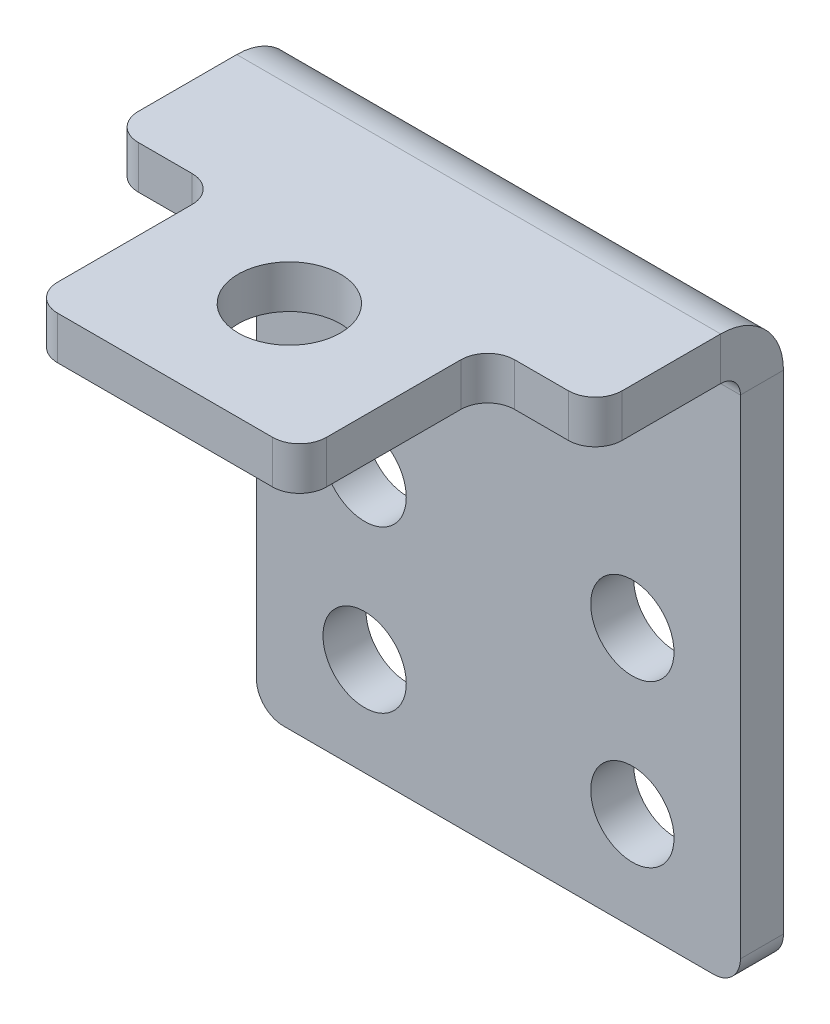
ISO-10303-21;
HEADER;
FILE_DESCRIPTION(('STEP AP214'),'2;1');
FILE_NAME('part.step','',(''),(''),'','','');
FILE_SCHEMA(('AUTOMOTIVE_DESIGN { 1 0 10303 214 1 1 1 1 }'));
ENDSEC;
DATA;
#1=APPLICATION_CONTEXT('core data for automotive mechanical design processes');
#2=APPLICATION_PROTOCOL_DEFINITION('international standard','automotive_design',2000,#1);
#3=PRODUCT_CONTEXT('',#1,'mechanical');
#4=PRODUCT('Part','Part','',(#3));
#5=PRODUCT_RELATED_PRODUCT_CATEGORY('part','',(#4));
#6=PRODUCT_DEFINITION_FORMATION('','',#4);
#7=PRODUCT_DEFINITION_CONTEXT('part definition',#1,'design');
#8=PRODUCT_DEFINITION('design','',#6,#7);
#9=PRODUCT_DEFINITION_SHAPE('','',#8);
#10=(LENGTH_UNIT() NAMED_UNIT(*) SI_UNIT(.MILLI.,.METRE.));
#11=(NAMED_UNIT(*) PLANE_ANGLE_UNIT() SI_UNIT($,.RADIAN.));
#12=(NAMED_UNIT(*) SI_UNIT($,.STERADIAN.) SOLID_ANGLE_UNIT());
#13=UNCERTAINTY_MEASURE_WITH_UNIT(LENGTH_MEASURE(1.E-05),#10,'distance_accuracy_value','');
#14=(GEOMETRIC_REPRESENTATION_CONTEXT(3) GLOBAL_UNCERTAINTY_ASSIGNED_CONTEXT((#13)) GLOBAL_UNIT_ASSIGNED_CONTEXT((#10,
#11,#12)) REPRESENTATION_CONTEXT('',''));
#15=CARTESIAN_POINT('',(0.,0.,0.));
#16=DIRECTION('',(0.,0.,1.));
#17=DIRECTION('',(1.,0.,0.));
#18=AXIS2_PLACEMENT_3D('',#15,#16,#17);
#19=CARTESIAN_POINT('',(0.,0.,-1.6));
#20=DIRECTION('',(-1.,0.,0.));
#21=DIRECTION('',(0.,0.,1.));
#22=AXIS2_PLACEMENT_3D('',#19,#20,#21);
#23=PLANE('',#22);
#24=DIRECTION('',(0.,-1.,0.));
#25=VECTOR('',#24,1.);
#26=CARTESIAN_POINT('',(0.,0.,-1.6));
#27=LINE('',#26,#25);
#28=CARTESIAN_POINT('',(0.,19.1634,-1.6));
#29=VERTEX_POINT('',#28);
#30=CARTESIAN_POINT('',(0.,1.,-1.6));
#31=VERTEX_POINT('',#30);
#32=EDGE_CURVE('E324',#29,#31,#27,.T.);
#33=ORIENTED_EDGE('',*,*,#32,.T.);
#34=DIRECTION('',(0.,0.,1.));
#35=VECTOR('',#34,1.);
#36=CARTESIAN_POINT('',(0.,1.,-1.6));
#37=LINE('',#36,#35);
#38=CARTESIAN_POINT('',(0.,1.,0.));
#39=VERTEX_POINT('',#38);
#40=EDGE_CURVE('E379',#31,#39,#37,.T.);
#41=ORIENTED_EDGE('',*,*,#40,.T.);
#42=DIRECTION('',(0.,-1.,0.));
#43=VECTOR('',#42,1.);
#44=CARTESIAN_POINT('',(0.,0.,0.));
#45=LINE('',#44,#43);
#46=CARTESIAN_POINT('',(0.,19.1634,0.));
#47=VERTEX_POINT('',#46);
#48=EDGE_CURVE('E321',#47,#39,#45,.T.);
#49=ORIENTED_EDGE('',*,*,#48,.F.);
#50=DIRECTION('',(0.,0.,-1.));
#51=VECTOR('',#50,1.);
#52=CARTESIAN_POINT('',(0.,19.1634,0.));
#53=LINE('',#52,#51);
#54=EDGE_CURVE('E306',#47,#29,#53,.T.);
#55=ORIENTED_EDGE('',*,*,#54,.T.);
#56=EDGE_LOOP('',(#33,#41,#49,#55));
#57=FACE_BOUND('',#56,.T.);
#58=ADVANCED_FACE('F69',(#57),#23,.T.);
#59=CARTESIAN_POINT('',(0.,0.,-1.6));
#60=DIRECTION('',(0.,0.,-1.));
#61=DIRECTION('',(-1.,0.,0.));
#62=AXIS2_PLACEMENT_3D('',#59,#60,#61);
#63=PLANE('',#62);
#64=CARTESIAN_POINT('',(13.98,9.65000000000004,-1.6));
#65=DIRECTION('',(0.,0.,-1.));
#66=DIRECTION('',(-1.,0.,0.));
#67=AXIS2_PLACEMENT_3D('',#64,#65,#66);
#68=CIRCLE('',#67,1.5494);
#69=CARTESIAN_POINT('',(12.4306,9.65000000000004,-1.6));
#70=VERTEX_POINT('',#69);
#71=EDGE_CURVE('E493',#70,#70,#68,.T.);
#72=ORIENTED_EDGE('',*,*,#71,.F.);
#73=EDGE_LOOP('',(#72));
#74=FACE_BOUND('',#73,.T.);
#75=CARTESIAN_POINT('',(4.02,3.65000000000004,-1.6));
#76=DIRECTION('',(0.,0.,-1.));
#77=DIRECTION('',(-1.,0.,0.));
#78=AXIS2_PLACEMENT_3D('',#75,#76,#77);
#79=CIRCLE('',#78,1.5494);
#80=CARTESIAN_POINT('',(2.4706,3.65000000000004,-1.6));
#81=VERTEX_POINT('',#80);
#82=EDGE_CURVE('E505',#81,#81,#79,.T.);
#83=ORIENTED_EDGE('',*,*,#82,.F.);
#84=EDGE_LOOP('',(#83));
#85=FACE_BOUND('',#84,.T.);
#86=CARTESIAN_POINT('',(13.98,3.65000000000004,-1.6));
#87=DIRECTION('',(0.,0.,-1.));
#88=DIRECTION('',(-1.,0.,0.));
#89=AXIS2_PLACEMENT_3D('',#86,#87,#88);
#90=CIRCLE('',#89,1.5494);
#91=CARTESIAN_POINT('',(12.4306,3.65000000000004,-1.6));
#92=VERTEX_POINT('',#91);
#93=EDGE_CURVE('E509',#92,#92,#90,.T.);
#94=ORIENTED_EDGE('',*,*,#93,.F.);
#95=EDGE_LOOP('',(#94));
#96=FACE_BOUND('',#95,.T.);
#97=CARTESIAN_POINT('',(4.02,9.65000000000004,-1.6));
#98=DIRECTION('',(0.,0.,-1.));
#99=DIRECTION('',(-1.,0.,0.));
#100=AXIS2_PLACEMENT_3D('',#97,#98,#99);
#101=CIRCLE('',#100,1.5494);
#102=CARTESIAN_POINT('',(2.4706,9.65000000000004,-1.6));
#103=VERTEX_POINT('',#102);
#104=EDGE_CURVE('E513',#103,#103,#101,.T.);
#105=ORIENTED_EDGE('',*,*,#104,.F.);
#106=EDGE_LOOP('',(#105));
#107=FACE_BOUND('',#106,.T.);
#108=DIRECTION('',(0.,1.,0.));
#109=VECTOR('',#108,1.);
#110=CARTESIAN_POINT('',(18.,0.,-1.6));
#111=LINE('',#110,#109);
#112=CARTESIAN_POINT('',(18.,1.,-1.6));
#113=VERTEX_POINT('',#112);
#114=CARTESIAN_POINT('',(18.,19.1634,-1.6));
#115=VERTEX_POINT('',#114);
#116=EDGE_CURVE('E333',#113,#115,#111,.T.);
#117=ORIENTED_EDGE('',*,*,#116,.F.);
#118=CARTESIAN_POINT('',(17.,1.,-1.6));
#119=DIRECTION('',(0.,0.,-1.));
#120=DIRECTION('',(-1.,0.,0.));
#121=AXIS2_PLACEMENT_3D('',#118,#119,#120);
#122=CIRCLE('',#121,1.);
#123=CARTESIAN_POINT('',(17.,0.,-1.6));
#124=VERTEX_POINT('',#123);
#125=EDGE_CURVE('E376',#113,#124,#122,.T.);
#126=ORIENTED_EDGE('',*,*,#125,.T.);
#127=DIRECTION('',(1.,0.,0.));
#128=VECTOR('',#127,1.);
#129=CARTESIAN_POINT('',(0.,0.,-1.6));
#130=LINE('',#129,#128);
#131=CARTESIAN_POINT('',(1.,0.,-1.6));
#132=VERTEX_POINT('',#131);
#133=EDGE_CURVE('E328',#132,#124,#130,.T.);
#134=ORIENTED_EDGE('',*,*,#133,.F.);
#135=CARTESIAN_POINT('',(1.,1.,-1.6));
#136=DIRECTION('',(0.,0.,-1.));
#137=DIRECTION('',(-1.,0.,0.));
#138=AXIS2_PLACEMENT_3D('',#135,#136,#137);
#139=CIRCLE('',#138,1.);
#140=EDGE_CURVE('E373',#132,#31,#139,.T.);
#141=ORIENTED_EDGE('',*,*,#140,.T.);
#142=ORIENTED_EDGE('',*,*,#32,.F.);
#143=DIRECTION('',(-1.,0.,0.));
#144=VECTOR('',#143,1.);
#145=CARTESIAN_POINT('',(0.,19.1634,-1.6));
#146=LINE('',#145,#144);
#147=EDGE_CURVE('E266',#29,#115,#146,.F.);
#148=ORIENTED_EDGE('',*,*,#147,.T.);
#149=EDGE_LOOP('',(#117,#126,#134,#141,#142,#148));
#150=FACE_BOUND('',#149,.T.);
#151=ADVANCED_FACE('F540',(#74,#85,#96,#107,#150),#63,.T.);
#152=CARTESIAN_POINT('',(0.,0.,0.));
#153=DIRECTION('',(0.,0.,-1.));
#154=DIRECTION('',(-1.,0.,0.));
#155=AXIS2_PLACEMENT_3D('',#152,#153,#154);
#156=PLANE('',#155);
#157=CARTESIAN_POINT('',(13.98,9.65000000000004,0.));
#158=DIRECTION('',(0.,0.,1.));
#159=DIRECTION('',(1.,0.,0.));
#160=AXIS2_PLACEMENT_3D('',#157,#158,#159);
#161=CIRCLE('',#160,1.5494);
#162=CARTESIAN_POINT('',(15.5294,9.65000000000004,0.));
#163=VERTEX_POINT('',#162);
#164=EDGE_CURVE('E521',#163,#163,#161,.T.);
#165=ORIENTED_EDGE('',*,*,#164,.F.);
#166=EDGE_LOOP('',(#165));
#167=FACE_BOUND('',#166,.T.);
#168=CARTESIAN_POINT('',(4.02,3.65000000000004,0.));
#169=DIRECTION('',(0.,0.,1.));
#170=DIRECTION('',(1.,0.,0.));
#171=AXIS2_PLACEMENT_3D('',#168,#169,#170);
#172=CIRCLE('',#171,1.5494);
#173=CARTESIAN_POINT('',(5.5694,3.65000000000004,0.));
#174=VERTEX_POINT('',#173);
#175=EDGE_CURVE('E522',#174,#174,#172,.T.);
#176=ORIENTED_EDGE('',*,*,#175,.F.);
#177=EDGE_LOOP('',(#176));
#178=FACE_BOUND('',#177,.T.);
#179=CARTESIAN_POINT('',(13.98,3.65000000000004,0.));
#180=DIRECTION('',(0.,0.,1.));
#181=DIRECTION('',(1.,0.,0.));
#182=AXIS2_PLACEMENT_3D('',#179,#180,#181);
#183=CIRCLE('',#182,1.5494);
#184=CARTESIAN_POINT('',(15.5294,3.65000000000004,0.));
#185=VERTEX_POINT('',#184);
#186=EDGE_CURVE('E526',#185,#185,#183,.T.);
#187=ORIENTED_EDGE('',*,*,#186,.F.);
#188=EDGE_LOOP('',(#187));
#189=FACE_BOUND('',#188,.T.);
#190=CARTESIAN_POINT('',(4.02,9.65000000000004,0.));
#191=DIRECTION('',(0.,0.,1.));
#192=DIRECTION('',(1.,0.,0.));
#193=AXIS2_PLACEMENT_3D('',#190,#191,#192);
#194=CIRCLE('',#193,1.5494);
#195=CARTESIAN_POINT('',(5.5694,9.65000000000004,0.));
#196=VERTEX_POINT('',#195);
#197=EDGE_CURVE('E517',#196,#196,#194,.T.);
#198=ORIENTED_EDGE('',*,*,#197,.F.);
#199=EDGE_LOOP('',(#198));
#200=FACE_BOUND('',#199,.T.);
#201=DIRECTION('',(1.,0.,0.));
#202=VECTOR('',#201,1.);
#203=CARTESIAN_POINT('',(0.,0.,0.));
#204=LINE('',#203,#202);
#205=CARTESIAN_POINT('',(1.,0.,0.));
#206=VERTEX_POINT('',#205);
#207=CARTESIAN_POINT('',(17.,0.,0.));
#208=VERTEX_POINT('',#207);
#209=EDGE_CURVE('E340',#206,#208,#204,.T.);
#210=ORIENTED_EDGE('',*,*,#209,.T.);
#211=CARTESIAN_POINT('',(17.,1.,0.));
#212=DIRECTION('',(0.,0.,-1.));
#213=DIRECTION('',(-1.,0.,0.));
#214=AXIS2_PLACEMENT_3D('',#211,#212,#213);
#215=CIRCLE('',#214,1.);
#216=CARTESIAN_POINT('',(18.,1.,0.));
#217=VERTEX_POINT('',#216);
#218=EDGE_CURVE('E367',#208,#217,#215,.F.);
#219=ORIENTED_EDGE('',*,*,#218,.T.);
#220=DIRECTION('',(0.,1.,0.));
#221=VECTOR('',#220,1.);
#222=CARTESIAN_POINT('',(18.,0.,0.));
#223=LINE('',#222,#221);
#224=CARTESIAN_POINT('',(18.,19.1634,0.));
#225=VERTEX_POINT('',#224);
#226=EDGE_CURVE('E329',#217,#225,#223,.T.);
#227=ORIENTED_EDGE('',*,*,#226,.T.);
#228=DIRECTION('',(-1.,0.,0.));
#229=VECTOR('',#228,1.);
#230=CARTESIAN_POINT('',(0.,19.1634,0.));
#231=LINE('',#230,#229);
#232=EDGE_CURVE('E311',#47,#225,#231,.F.);
#233=ORIENTED_EDGE('',*,*,#232,.F.);
#234=ORIENTED_EDGE('',*,*,#48,.T.);
#235=CARTESIAN_POINT('',(1.,1.,0.));
#236=DIRECTION('',(0.,0.,-1.));
#237=DIRECTION('',(-1.,0.,0.));
#238=AXIS2_PLACEMENT_3D('',#235,#236,#237);
#239=CIRCLE('',#238,1.);
#240=EDGE_CURVE('E364',#39,#206,#239,.F.);
#241=ORIENTED_EDGE('',*,*,#240,.T.);
#242=EDGE_LOOP('',(#210,#219,#227,#233,#234,#241));
#243=FACE_BOUND('',#242,.T.);
#244=ADVANCED_FACE('F536',(#167,#178,#189,#200,#243),#156,.F.);
#245=CARTESIAN_POINT('',(18.,0.,-1.6));
#246=DIRECTION('',(1.,0.,0.));
#247=DIRECTION('',(0.,0.,-1.));
#248=AXIS2_PLACEMENT_3D('',#245,#246,#247);
#249=PLANE('',#248);
#250=ORIENTED_EDGE('',*,*,#226,.F.);
#251=DIRECTION('',(0.,0.,1.));
#252=VECTOR('',#251,1.);
#253=CARTESIAN_POINT('',(18.,1.,-1.6));
#254=LINE('',#253,#252);
#255=EDGE_CURVE('E370',#217,#113,#254,.F.);
#256=ORIENTED_EDGE('',*,*,#255,.T.);
#257=ORIENTED_EDGE('',*,*,#116,.T.);
#258=DIRECTION('',(0.,0.,-1.));
#259=VECTOR('',#258,1.);
#260=CARTESIAN_POINT('',(18.,19.1634,0.));
#261=LINE('',#260,#259);
#262=EDGE_CURVE('E317',#225,#115,#261,.T.);
#263=ORIENTED_EDGE('',*,*,#262,.F.);
#264=EDGE_LOOP('',(#250,#256,#257,#263));
#265=FACE_BOUND('',#264,.T.);
#266=ADVANCED_FACE('F539',(#265),#249,.T.);
#267=CARTESIAN_POINT('',(0.,0.,-1.6));
#268=DIRECTION('',(0.,-1.,0.));
#269=DIRECTION('',(0.,0.,-1.));
#270=AXIS2_PLACEMENT_3D('',#267,#268,#269);
#271=PLANE('',#270);
#272=ORIENTED_EDGE('',*,*,#133,.T.);
#273=DIRECTION('',(0.,0.,1.));
#274=VECTOR('',#273,1.);
#275=CARTESIAN_POINT('',(17.,0.,-1.6));
#276=LINE('',#275,#274);
#277=EDGE_CURVE('E360',#124,#208,#276,.T.);
#278=ORIENTED_EDGE('',*,*,#277,.T.);
#279=ORIENTED_EDGE('',*,*,#209,.F.);
#280=DIRECTION('',(0.,0.,1.));
#281=VECTOR('',#280,1.);
#282=CARTESIAN_POINT('',(1.,0.,-1.6));
#283=LINE('',#282,#281);
#284=EDGE_CURVE('E357',#206,#132,#283,.F.);
#285=ORIENTED_EDGE('',*,*,#284,.T.);
#286=EDGE_LOOP('',(#272,#278,#279,#285));
#287=FACE_BOUND('',#286,.T.);
#288=ADVANCED_FACE('F549',(#287),#271,.T.);
#289=CARTESIAN_POINT('',(18.,19.1634,0.736599999999999));
#290=DIRECTION('',(1.,0.,0.));
#291=DIRECTION('',(0.,0.,-1.));
#292=AXIS2_PLACEMENT_3D('',#289,#290,#291);
#293=PLANE('',#292);
#294=DIRECTION('',(0.,1.,0.));
#295=VECTOR('',#294,1.);
#296=CARTESIAN_POINT('',(18.,21.5,0.736599999999992));
#297=LINE('',#296,#295);
#298=CARTESIAN_POINT('',(18.,19.9,0.736599999999997));
#299=VERTEX_POINT('',#298);
#300=CARTESIAN_POINT('',(18.,21.5,0.736599999999991));
#301=VERTEX_POINT('',#300);
#302=EDGE_CURVE('E297',#299,#301,#297,.T.);
#303=ORIENTED_EDGE('',*,*,#302,.F.);
#304=CARTESIAN_POINT('',(18.,19.1634,0.736599999999999));
#305=DIRECTION('',(-1.,0.,0.));
#306=DIRECTION('',(0.,0.,1.));
#307=AXIS2_PLACEMENT_3D('',#304,#305,#306);
#308=CIRCLE('',#307,0.7366);
#309=EDGE_CURVE('E270',#225,#299,#308,.F.);
#310=ORIENTED_EDGE('',*,*,#309,.F.);
#311=ORIENTED_EDGE('',*,*,#262,.T.);
#312=CARTESIAN_POINT('',(18.,19.1634,0.736599999999999));
#313=DIRECTION('',(-1.,0.,0.));
#314=DIRECTION('',(0.,0.,1.));
#315=AXIS2_PLACEMENT_3D('',#312,#313,#314);
#316=CIRCLE('',#315,2.3366);
#317=EDGE_CURVE('E304',#115,#301,#316,.F.);
#318=ORIENTED_EDGE('',*,*,#317,.T.);
#319=EDGE_LOOP('',(#303,#310,#311,#318));
#320=FACE_BOUND('',#319,.T.);
#321=ADVANCED_FACE('F572',(#320),#293,.T.);
#322=CARTESIAN_POINT('',(0.,19.1634,0.736599999999999));
#323=DIRECTION('',(1.,0.,0.));
#324=DIRECTION('',(0.,0.,-1.));
#325=AXIS2_PLACEMENT_3D('',#322,#323,#324);
#326=PLANE('',#325);
#327=CARTESIAN_POINT('',(0.,19.1634,0.736599999999999));
#328=DIRECTION('',(-1.,0.,0.));
#329=DIRECTION('',(0.,0.,1.));
#330=AXIS2_PLACEMENT_3D('',#327,#328,#329);
#331=CIRCLE('',#330,0.7366);
#332=CARTESIAN_POINT('',(0.,19.9,0.736599999999997));
#333=VERTEX_POINT('',#332);
#334=EDGE_CURVE('E255',#333,#47,#331,.T.);
#335=ORIENTED_EDGE('',*,*,#334,.F.);
#336=DIRECTION('',(0.,1.,0.));
#337=VECTOR('',#336,1.);
#338=CARTESIAN_POINT('',(0.,19.9,0.736599999999997));
#339=LINE('',#338,#337);
#340=CARTESIAN_POINT('',(0.,21.5,0.736599999999992));
#341=VERTEX_POINT('',#340);
#342=EDGE_CURVE('E249',#333,#341,#339,.T.);
#343=ORIENTED_EDGE('',*,*,#342,.T.);
#344=CARTESIAN_POINT('',(0.,19.1634,0.736599999999999));
#345=DIRECTION('',(-1.,0.,0.));
#346=DIRECTION('',(0.,0.,1.));
#347=AXIS2_PLACEMENT_3D('',#344,#345,#346);
#348=CIRCLE('',#347,2.3366);
#349=EDGE_CURVE('E260',#341,#29,#348,.T.);
#350=ORIENTED_EDGE('',*,*,#349,.T.);
#351=ORIENTED_EDGE('',*,*,#54,.F.);
#352=EDGE_LOOP('',(#335,#343,#350,#351));
#353=FACE_BOUND('',#352,.T.);
#354=ADVANCED_FACE('F273',(#353),#326,.F.);
#355=CARTESIAN_POINT('',(0.,19.1634,0.736599999999999));
#356=DIRECTION('',(-1.,0.,0.));
#357=DIRECTION('',(0.,1.,0.));
#358=AXIS2_PLACEMENT_3D('',#355,#356,#357);
#359=CYLINDRICAL_SURFACE('',#358,2.3366);
#360=ORIENTED_EDGE('',*,*,#147,.F.);
#361=ORIENTED_EDGE('',*,*,#349,.F.);
#362=DIRECTION('',(-1.,0.,0.));
#363=VECTOR('',#362,1.);
#364=CARTESIAN_POINT('',(0.,21.5,0.736599999999992));
#365=LINE('',#364,#363);
#366=EDGE_CURVE('E263',#301,#341,#365,.T.);
#367=ORIENTED_EDGE('',*,*,#366,.F.);
#368=ORIENTED_EDGE('',*,*,#317,.F.);
#369=EDGE_LOOP('',(#360,#361,#367,#368));
#370=FACE_BOUND('',#369,.T.);
#371=ADVANCED_FACE('F261',(#370),#359,.T.);
#372=CARTESIAN_POINT('',(0.,19.1634,0.736599999999999));
#373=DIRECTION('',(-1.,0.,0.));
#374=DIRECTION('',(0.,1.,0.));
#375=AXIS2_PLACEMENT_3D('',#372,#373,#374);
#376=CYLINDRICAL_SURFACE('',#375,0.7366);
#377=ORIENTED_EDGE('',*,*,#232,.T.);
#378=ORIENTED_EDGE('',*,*,#309,.T.);
#379=DIRECTION('',(1.,0.,0.));
#380=VECTOR('',#379,1.);
#381=CARTESIAN_POINT('',(18.,19.9,0.736599999999997));
#382=LINE('',#381,#380);
#383=EDGE_CURVE('E276',#299,#333,#382,.F.);
#384=ORIENTED_EDGE('',*,*,#383,.T.);
#385=ORIENTED_EDGE('',*,*,#334,.T.);
#386=EDGE_LOOP('',(#377,#378,#384,#385));
#387=FACE_BOUND('',#386,.T.);
#388=ADVANCED_FACE('F563',(#387),#376,.F.);
#389=CARTESIAN_POINT('',(0.,21.5,0.));
#390=DIRECTION('',(-1.,0.,0.));
#391=DIRECTION('',(0.,0.,1.));
#392=AXIS2_PLACEMENT_3D('',#389,#390,#391);
#393=PLANE('',#392);
#394=DIRECTION('',(0.,0.,1.));
#395=VECTOR('',#394,1.);
#396=CARTESIAN_POINT('',(0.,19.9,0.));
#397=LINE('',#396,#395);
#398=CARTESIAN_POINT('',(0.,19.9,4.39999999999998));
#399=VERTEX_POINT('',#398);
#400=EDGE_CURVE('E475',#399,#333,#397,.F.);
#401=ORIENTED_EDGE('',*,*,#400,.F.);
#402=DIRECTION('',(0.,1.,0.));
#403=VECTOR('',#402,1.);
#404=CARTESIAN_POINT('',(0.,21.5,4.39999999999998));
#405=LINE('',#404,#403);
#406=CARTESIAN_POINT('',(0.,21.5,4.39999999999998));
#407=VERTEX_POINT('',#406);
#408=EDGE_CURVE('E251',#399,#407,#405,.T.);
#409=ORIENTED_EDGE('',*,*,#408,.T.);
#410=DIRECTION('',(0.,0.,-1.));
#411=VECTOR('',#410,1.);
#412=CARTESIAN_POINT('',(0.,21.5,0.));
#413=LINE('',#412,#411);
#414=EDGE_CURVE('E244',#407,#341,#413,.T.);
#415=ORIENTED_EDGE('',*,*,#414,.T.);
#416=ORIENTED_EDGE('',*,*,#342,.F.);
#417=EDGE_LOOP('',(#401,#409,#415,#416));
#418=FACE_BOUND('',#417,.T.);
#419=ADVANCED_FACE('F247',(#418),#393,.T.);
#420=CARTESIAN_POINT('',(18.,21.5,12.4));
#421=DIRECTION('',(1.,0.,0.));
#422=DIRECTION('',(0.,0.,-1.));
#423=AXIS2_PLACEMENT_3D('',#420,#421,#422);
#424=PLANE('',#423);
#425=DIRECTION('',(0.,0.,1.));
#426=VECTOR('',#425,1.);
#427=CARTESIAN_POINT('',(18.,21.5,12.4));
#428=LINE('',#427,#426);
#429=CARTESIAN_POINT('',(18.,21.5,4.39999999999998));
#430=VERTEX_POINT('',#429);
#431=EDGE_CURVE('E283',#301,#430,#428,.T.);
#432=ORIENTED_EDGE('',*,*,#431,.T.);
#433=DIRECTION('',(0.,1.,0.));
#434=VECTOR('',#433,1.);
#435=CARTESIAN_POINT('',(18.,19.9,4.39999999999998));
#436=LINE('',#435,#434);
#437=CARTESIAN_POINT('',(18.,19.9,4.39999999999998));
#438=VERTEX_POINT('',#437);
#439=EDGE_CURVE('E401',#430,#438,#436,.F.);
#440=ORIENTED_EDGE('',*,*,#439,.T.);
#441=DIRECTION('',(0.,0.,-1.));
#442=VECTOR('',#441,1.);
#443=CARTESIAN_POINT('',(18.,19.9,0.));
#444=LINE('',#443,#442);
#445=EDGE_CURVE('E285',#299,#438,#444,.F.);
#446=ORIENTED_EDGE('',*,*,#445,.F.);
#447=ORIENTED_EDGE('',*,*,#302,.T.);
#448=EDGE_LOOP('',(#432,#440,#446,#447));
#449=FACE_BOUND('',#448,.T.);
#450=ADVANCED_FACE('F576',(#449),#424,.T.);
#451=CARTESIAN_POINT('',(0.,21.5,0.));
#452=DIRECTION('',(0.,1.,0.));
#453=DIRECTION('',(0.,0.,1.));
#454=AXIS2_PLACEMENT_3D('',#451,#452,#453);
#455=PLANE('',#454);
#456=DIRECTION('',(-1.,0.,0.));
#457=VECTOR('',#456,1.);
#458=CARTESIAN_POINT('',(14.,21.5,5.39999999999998));
#459=LINE('',#458,#457);
#460=CARTESIAN_POINT('',(17.,21.5,5.39999999999998));
#461=VERTEX_POINT('',#460);
#462=CARTESIAN_POINT('',(15.,21.5,5.39999999999998));
#463=VERTEX_POINT('',#462);
#464=EDGE_CURVE('E463',#461,#463,#459,.T.);
#465=ORIENTED_EDGE('',*,*,#464,.F.);
#466=CARTESIAN_POINT('',(17.,21.5,4.39999999999998));
#467=DIRECTION('',(0.,1.,0.));
#468=DIRECTION('',(0.,0.,1.));
#469=AXIS2_PLACEMENT_3D('',#466,#467,#468);
#470=CIRCLE('',#469,1.);
#471=EDGE_CURVE('E399',#461,#430,#470,.T.);
#472=ORIENTED_EDGE('',*,*,#471,.T.);
#473=ORIENTED_EDGE('',*,*,#431,.F.);
#474=ORIENTED_EDGE('',*,*,#366,.T.);
#475=ORIENTED_EDGE('',*,*,#414,.F.);
#476=CARTESIAN_POINT('',(1.,21.5,4.39999999999998));
#477=DIRECTION('',(0.,1.,0.));
#478=DIRECTION('',(0.,0.,1.));
#479=AXIS2_PLACEMENT_3D('',#476,#477,#478);
#480=CIRCLE('',#479,1.);
#481=CARTESIAN_POINT('',(1.,21.5,5.39999999999998));
#482=VERTEX_POINT('',#481);
#483=EDGE_CURVE('E390',#407,#482,#480,.T.);
#484=ORIENTED_EDGE('',*,*,#483,.T.);
#485=DIRECTION('',(-1.,0.,0.));
#486=VECTOR('',#485,1.);
#487=CARTESIAN_POINT('',(0.,21.5,5.39999999999998));
#488=LINE('',#487,#486);
#489=CARTESIAN_POINT('',(3.,21.5,5.39999999999998));
#490=VERTEX_POINT('',#489);
#491=EDGE_CURVE('E454',#490,#482,#488,.T.);
#492=ORIENTED_EDGE('',*,*,#491,.F.);
#493=CARTESIAN_POINT('',(3.,21.5,6.39999999999998));
#494=DIRECTION('',(0.,1.,0.));
#495=DIRECTION('',(0.,0.,1.));
#496=AXIS2_PLACEMENT_3D('',#493,#494,#495);
#497=CIRCLE('',#496,1.);
#498=CARTESIAN_POINT('',(4.,21.5,6.39999999999998));
#499=VERTEX_POINT('',#498);
#500=EDGE_CURVE('E78',#490,#499,#497,.F.);
#501=ORIENTED_EDGE('',*,*,#500,.T.);
#502=DIRECTION('',(0.,0.,-1.));
#503=VECTOR('',#502,1.);
#504=CARTESIAN_POINT('',(4.,21.5,5.39999999999998));
#505=LINE('',#504,#503);
#506=CARTESIAN_POINT('',(4.,21.5,11.4));
#507=VERTEX_POINT('',#506);
#508=EDGE_CURVE('E452',#507,#499,#505,.T.);
#509=ORIENTED_EDGE('',*,*,#508,.F.);
#510=CARTESIAN_POINT('',(5.,21.5,11.4));
#511=DIRECTION('',(0.,1.,0.));
#512=DIRECTION('',(0.,0.,1.));
#513=AXIS2_PLACEMENT_3D('',#510,#511,#512);
#514=CIRCLE('',#513,1.);
#515=CARTESIAN_POINT('',(5.,21.5,12.4));
#516=VERTEX_POINT('',#515);
#517=EDGE_CURVE('E393',#507,#516,#514,.T.);
#518=ORIENTED_EDGE('',*,*,#517,.T.);
#519=DIRECTION('',(-1.,0.,0.));
#520=VECTOR('',#519,1.);
#521=CARTESIAN_POINT('',(0.,21.5,12.4));
#522=LINE('',#521,#520);
#523=CARTESIAN_POINT('',(13.,21.5,12.4));
#524=VERTEX_POINT('',#523);
#525=EDGE_CURVE('E256',#524,#516,#522,.T.);
#526=ORIENTED_EDGE('',*,*,#525,.F.);
#527=CARTESIAN_POINT('',(13.,21.5,11.4));
#528=DIRECTION('',(0.,1.,0.));
#529=DIRECTION('',(0.,0.,1.));
#530=AXIS2_PLACEMENT_3D('',#527,#528,#529);
#531=CIRCLE('',#530,1.);
#532=CARTESIAN_POINT('',(14.,21.5,11.4));
#533=VERTEX_POINT('',#532);
#534=EDGE_CURVE('E396',#524,#533,#531,.T.);
#535=ORIENTED_EDGE('',*,*,#534,.T.);
#536=DIRECTION('',(0.,0.,1.));
#537=VECTOR('',#536,1.);
#538=CARTESIAN_POINT('',(14.,21.5,12.4));
#539=LINE('',#538,#537);
#540=CARTESIAN_POINT('',(14.,21.5,6.39999999999998));
#541=VERTEX_POINT('',#540);
#542=EDGE_CURVE('E492',#541,#533,#539,.T.);
#543=ORIENTED_EDGE('',*,*,#542,.F.);
#544=CARTESIAN_POINT('',(15.,21.5,6.39999999999998));
#545=DIRECTION('',(0.,1.,0.));
#546=DIRECTION('',(0.,0.,1.));
#547=AXIS2_PLACEMENT_3D('',#544,#545,#546);
#548=CIRCLE('',#547,1.);
#549=EDGE_CURVE('E442',#541,#463,#548,.F.);
#550=ORIENTED_EDGE('',*,*,#549,.T.);
#551=EDGE_LOOP('',(#465,#472,#473,#474,#475,#484,#492,#501,#509,#518,#526,#535,#543,#550));
#552=FACE_BOUND('',#551,.T.);
#553=CARTESIAN_POINT('',(9.,21.5,7.77999999999999));
#554=DIRECTION('',(0.,1.,0.));
#555=DIRECTION('',(0.,0.,1.));
#556=AXIS2_PLACEMENT_3D('',#553,#554,#555);
#557=CIRCLE('',#556,1.9);
#558=CARTESIAN_POINT('',(9.,21.5,9.67999999999999));
#559=VERTEX_POINT('',#558);
#560=EDGE_CURVE('E488',#559,#559,#557,.T.);
#561=ORIENTED_EDGE('',*,*,#560,.F.);
#562=EDGE_LOOP('',(#561));
#563=FACE_BOUND('',#562,.T.);
#564=ADVANCED_FACE('F280',(#552,#563),#455,.T.);
#565=CARTESIAN_POINT('',(0.,19.9,0.));
#566=DIRECTION('',(0.,1.,0.));
#567=DIRECTION('',(0.,0.,1.));
#568=AXIS2_PLACEMENT_3D('',#565,#566,#567);
#569=PLANE('',#568);
#570=CARTESIAN_POINT('',(9.,19.9,7.78));
#571=DIRECTION('',(0.,1.,0.));
#572=DIRECTION('',(0.,0.,1.));
#573=AXIS2_PLACEMENT_3D('',#570,#571,#572);
#574=CIRCLE('',#573,1.9);
#575=CARTESIAN_POINT('',(9.,19.9,9.68));
#576=VERTEX_POINT('',#575);
#577=EDGE_CURVE('E301',#576,#576,#574,.T.);
#578=ORIENTED_EDGE('',*,*,#577,.T.);
#579=EDGE_LOOP('',(#578));
#580=FACE_BOUND('',#579,.T.);
#581=ORIENTED_EDGE('',*,*,#445,.T.);
#582=CARTESIAN_POINT('',(17.,19.9,4.39999999999998));
#583=DIRECTION('',(0.,1.,0.));
#584=DIRECTION('',(0.,0.,1.));
#585=AXIS2_PLACEMENT_3D('',#582,#583,#584);
#586=CIRCLE('',#585,1.);
#587=CARTESIAN_POINT('',(17.,19.9,5.39999999999998));
#588=VERTEX_POINT('',#587);
#589=EDGE_CURVE('E410',#438,#588,#586,.F.);
#590=ORIENTED_EDGE('',*,*,#589,.T.);
#591=DIRECTION('',(-1.,0.,0.));
#592=VECTOR('',#591,1.);
#593=CARTESIAN_POINT('',(0.,19.9,5.39999999999998));
#594=LINE('',#593,#592);
#595=CARTESIAN_POINT('',(15.,19.9,5.39999999999998));
#596=VERTEX_POINT('',#595);
#597=EDGE_CURVE('E336',#588,#596,#594,.T.);
#598=ORIENTED_EDGE('',*,*,#597,.T.);
#599=CARTESIAN_POINT('',(15.,19.9,6.39999999999998));
#600=DIRECTION('',(0.,1.,0.));
#601=DIRECTION('',(0.,0.,1.));
#602=AXIS2_PLACEMENT_3D('',#599,#600,#601);
#603=CIRCLE('',#602,1.);
#604=CARTESIAN_POINT('',(14.,19.9,6.39999999999998));
#605=VERTEX_POINT('',#604);
#606=EDGE_CURVE('E445',#596,#605,#603,.T.);
#607=ORIENTED_EDGE('',*,*,#606,.T.);
#608=DIRECTION('',(0.,0.,1.));
#609=VECTOR('',#608,1.);
#610=CARTESIAN_POINT('',(14.,19.9,0.));
#611=LINE('',#610,#609);
#612=CARTESIAN_POINT('',(14.,19.9,11.4));
#613=VERTEX_POINT('',#612);
#614=EDGE_CURVE('E485',#605,#613,#611,.T.);
#615=ORIENTED_EDGE('',*,*,#614,.T.);
#616=CARTESIAN_POINT('',(13.,19.9,11.4));
#617=DIRECTION('',(0.,1.,0.));
#618=DIRECTION('',(0.,0.,1.));
#619=AXIS2_PLACEMENT_3D('',#616,#617,#618);
#620=CIRCLE('',#619,1.);
#621=CARTESIAN_POINT('',(13.,19.9,12.4));
#622=VERTEX_POINT('',#621);
#623=EDGE_CURVE('E98',#613,#622,#620,.F.);
#624=ORIENTED_EDGE('',*,*,#623,.T.);
#625=DIRECTION('',(1.,0.,0.));
#626=VECTOR('',#625,1.);
#627=CARTESIAN_POINT('',(0.,19.9,12.4));
#628=LINE('',#627,#626);
#629=CARTESIAN_POINT('',(5.,19.9,12.4));
#630=VERTEX_POINT('',#629);
#631=EDGE_CURVE('E291',#622,#630,#628,.F.);
#632=ORIENTED_EDGE('',*,*,#631,.T.);
#633=CARTESIAN_POINT('',(5.,19.9,11.4));
#634=DIRECTION('',(0.,1.,0.));
#635=DIRECTION('',(0.,0.,1.));
#636=AXIS2_PLACEMENT_3D('',#633,#634,#635);
#637=CIRCLE('',#636,1.);
#638=CARTESIAN_POINT('',(4.,19.9,11.4));
#639=VERTEX_POINT('',#638);
#640=EDGE_CURVE('E405',#630,#639,#637,.F.);
#641=ORIENTED_EDGE('',*,*,#640,.T.);
#642=DIRECTION('',(0.,0.,-1.));
#643=VECTOR('',#642,1.);
#644=CARTESIAN_POINT('',(4.,19.9,0.));
#645=LINE('',#644,#643);
#646=CARTESIAN_POINT('',(4.,19.9,6.39999999999998));
#647=VERTEX_POINT('',#646);
#648=EDGE_CURVE('E349',#639,#647,#645,.T.);
#649=ORIENTED_EDGE('',*,*,#648,.T.);
#650=CARTESIAN_POINT('',(3.,19.9,6.39999999999998));
#651=DIRECTION('',(0.,1.,0.));
#652=DIRECTION('',(0.,0.,1.));
#653=AXIS2_PLACEMENT_3D('',#650,#651,#652);
#654=CIRCLE('',#653,1.);
#655=CARTESIAN_POINT('',(3.,19.9,5.39999999999998));
#656=VERTEX_POINT('',#655);
#657=EDGE_CURVE('E13',#647,#656,#654,.T.);
#658=ORIENTED_EDGE('',*,*,#657,.T.);
#659=DIRECTION('',(-1.,0.,0.));
#660=VECTOR('',#659,1.);
#661=CARTESIAN_POINT('',(0.,19.9,5.39999999999998));
#662=LINE('',#661,#660);
#663=CARTESIAN_POINT('',(1.,19.9,5.39999999999998));
#664=VERTEX_POINT('',#663);
#665=EDGE_CURVE('E353',#656,#664,#662,.T.);
#666=ORIENTED_EDGE('',*,*,#665,.T.);
#667=CARTESIAN_POINT('',(1.,19.9,4.39999999999998));
#668=DIRECTION('',(0.,1.,0.));
#669=DIRECTION('',(0.,0.,1.));
#670=AXIS2_PLACEMENT_3D('',#667,#668,#669);
#671=CIRCLE('',#670,1.);
#672=EDGE_CURVE('E403',#664,#399,#671,.F.);
#673=ORIENTED_EDGE('',*,*,#672,.T.);
#674=ORIENTED_EDGE('',*,*,#400,.T.);
#675=ORIENTED_EDGE('',*,*,#383,.F.);
#676=EDGE_LOOP('',(#581,#590,#598,#607,#615,#624,#632,#641,#649,#658,#666,#673,#674,#675));
#677=FACE_BOUND('',#676,.T.);
#678=ADVANCED_FACE('F468',(#580,#677),#569,.F.);
#679=CARTESIAN_POINT('',(0.,21.5,12.4));
#680=DIRECTION('',(0.,0.,1.));
#681=DIRECTION('',(0.,-1.,0.));
#682=AXIS2_PLACEMENT_3D('',#679,#680,#681);
#683=PLANE('',#682);
#684=ORIENTED_EDGE('',*,*,#631,.F.);
#685=DIRECTION('',(0.,-1.,0.));
#686=VECTOR('',#685,1.);
#687=CARTESIAN_POINT('',(13.,21.5,12.4));
#688=LINE('',#687,#686);
#689=EDGE_CURVE('E423',#622,#524,#688,.F.);
#690=ORIENTED_EDGE('',*,*,#689,.T.);
#691=ORIENTED_EDGE('',*,*,#525,.T.);
#692=DIRECTION('',(0.,1.,0.));
#693=VECTOR('',#692,1.);
#694=CARTESIAN_POINT('',(5.,19.9,12.4));
#695=LINE('',#694,#693);
#696=EDGE_CURVE('E88',#516,#630,#695,.F.);
#697=ORIENTED_EDGE('',*,*,#696,.T.);
#698=EDGE_LOOP('',(#684,#690,#691,#697));
#699=FACE_BOUND('',#698,.T.);
#700=ADVANCED_FACE('F599',(#699),#683,.T.);
#701=CARTESIAN_POINT('',(14.,11.5,5.40000000000001));
#702=DIRECTION('',(0.,0.,-1.));
#703=DIRECTION('',(0.,1.,0.));
#704=AXIS2_PLACEMENT_3D('',#701,#702,#703);
#705=PLANE('',#704);
#706=ORIENTED_EDGE('',*,*,#597,.F.);
#707=DIRECTION('',(0.,1.,0.));
#708=VECTOR('',#707,1.);
#709=CARTESIAN_POINT('',(17.,21.5,5.39999999999998));
#710=LINE('',#709,#708);
#711=EDGE_CURVE('E386',#588,#461,#710,.T.);
#712=ORIENTED_EDGE('',*,*,#711,.T.);
#713=ORIENTED_EDGE('',*,*,#464,.T.);
#714=DIRECTION('',(0.,1.,0.));
#715=VECTOR('',#714,1.);
#716=CARTESIAN_POINT('',(15.,19.9,5.39999999999998));
#717=LINE('',#716,#715);
#718=EDGE_CURVE('E383',#463,#596,#717,.F.);
#719=ORIENTED_EDGE('',*,*,#718,.T.);
#720=EDGE_LOOP('',(#706,#712,#713,#719));
#721=FACE_BOUND('',#720,.T.);
#722=ADVANCED_FACE('F584',(#721),#705,.F.);
#723=CARTESIAN_POINT('',(14.,11.5,12.4));
#724=DIRECTION('',(-1.,0.,0.));
#725=DIRECTION('',(0.,0.,1.));
#726=AXIS2_PLACEMENT_3D('',#723,#724,#725);
#727=PLANE('',#726);
#728=ORIENTED_EDGE('',*,*,#614,.F.);
#729=DIRECTION('',(0.,1.,0.));
#730=VECTOR('',#729,1.);
#731=CARTESIAN_POINT('',(14.,21.5,6.39999999999998));
#732=LINE('',#731,#730);
#733=EDGE_CURVE('E417',#605,#541,#732,.T.);
#734=ORIENTED_EDGE('',*,*,#733,.T.);
#735=ORIENTED_EDGE('',*,*,#542,.T.);
#736=DIRECTION('',(0.,-1.,0.));
#737=VECTOR('',#736,1.);
#738=CARTESIAN_POINT('',(14.,19.9,11.4));
#739=LINE('',#738,#737);
#740=EDGE_CURVE('E413',#533,#613,#739,.T.);
#741=ORIENTED_EDGE('',*,*,#740,.T.);
#742=EDGE_LOOP('',(#728,#734,#735,#741));
#743=FACE_BOUND('',#742,.T.);
#744=ADVANCED_FACE('F591',(#743),#727,.F.);
#745=CARTESIAN_POINT('',(0.,11.5,5.40000000000001));
#746=DIRECTION('',(0.,0.,-1.));
#747=DIRECTION('',(0.,1.,0.));
#748=AXIS2_PLACEMENT_3D('',#745,#746,#747);
#749=PLANE('',#748);
#750=ORIENTED_EDGE('',*,*,#665,.F.);
#751=DIRECTION('',(0.,1.,0.));
#752=VECTOR('',#751,1.);
#753=CARTESIAN_POINT('',(3.,21.5,5.39999999999998));
#754=LINE('',#753,#752);
#755=EDGE_CURVE('E436',#656,#490,#754,.T.);
#756=ORIENTED_EDGE('',*,*,#755,.T.);
#757=ORIENTED_EDGE('',*,*,#491,.T.);
#758=DIRECTION('',(0.,1.,0.));
#759=VECTOR('',#758,1.);
#760=CARTESIAN_POINT('',(1.,19.9,5.39999999999998));
#761=LINE('',#760,#759);
#762=EDGE_CURVE('E433',#482,#664,#761,.F.);
#763=ORIENTED_EDGE('',*,*,#762,.T.);
#764=EDGE_LOOP('',(#750,#756,#757,#763));
#765=FACE_BOUND('',#764,.T.);
#766=ADVANCED_FACE('F471',(#765),#749,.F.);
#767=CARTESIAN_POINT('',(4.,11.5,5.40000000000001));
#768=DIRECTION('',(1.,0.,0.));
#769=DIRECTION('',(0.,0.,-1.));
#770=AXIS2_PLACEMENT_3D('',#767,#768,#769);
#771=PLANE('',#770);
#772=ORIENTED_EDGE('',*,*,#648,.F.);
#773=DIRECTION('',(0.,1.,0.));
#774=VECTOR('',#773,1.);
#775=CARTESIAN_POINT('',(4.,21.5,11.4));
#776=LINE('',#775,#774);
#777=EDGE_CURVE('E429',#639,#507,#776,.T.);
#778=ORIENTED_EDGE('',*,*,#777,.T.);
#779=ORIENTED_EDGE('',*,*,#508,.T.);
#780=DIRECTION('',(0.,1.,0.));
#781=VECTOR('',#780,1.);
#782=CARTESIAN_POINT('',(4.,19.9,6.39999999999998));
#783=LINE('',#782,#781);
#784=EDGE_CURVE('E426',#499,#647,#783,.F.);
#785=ORIENTED_EDGE('',*,*,#784,.T.);
#786=EDGE_LOOP('',(#772,#778,#779,#785));
#787=FACE_BOUND('',#786,.T.);
#788=ADVANCED_FACE('F460',(#787),#771,.F.);
#789=CARTESIAN_POINT('',(9.,11.5,7.78000000000003));
#790=DIRECTION('',(0.,1.,0.));
#791=DIRECTION('',(0.,0.,1.));
#792=AXIS2_PLACEMENT_3D('',#789,#790,#791);
#793=CYLINDRICAL_SURFACE('',#792,1.9);
#794=ORIENTED_EDGE('',*,*,#560,.T.);
#795=EDGE_LOOP('',(#794));
#796=FACE_BOUND('',#795,.T.);
#797=ORIENTED_EDGE('',*,*,#577,.F.);
#798=EDGE_LOOP('',(#797));
#799=FACE_BOUND('',#798,.T.);
#800=ADVANCED_FACE('F622',(#796,#799),#793,.F.);
#801=CARTESIAN_POINT('',(17.,1.,-1.6));
#802=DIRECTION('',(0.,0.,1.));
#803=DIRECTION('',(1.,0.,0.));
#804=AXIS2_PLACEMENT_3D('',#801,#802,#803);
#805=CYLINDRICAL_SURFACE('',#804,1.);
#806=ORIENTED_EDGE('',*,*,#125,.F.);
#807=ORIENTED_EDGE('',*,*,#255,.F.);
#808=ORIENTED_EDGE('',*,*,#218,.F.);
#809=ORIENTED_EDGE('',*,*,#277,.F.);
#810=EDGE_LOOP('',(#806,#807,#808,#809));
#811=FACE_BOUND('',#810,.T.);
#812=ADVANCED_FACE('F570',(#811),#805,.T.);
#813=CARTESIAN_POINT('',(1.,1.,-1.6));
#814=DIRECTION('',(0.,0.,1.));
#815=DIRECTION('',(1.,0.,0.));
#816=AXIS2_PLACEMENT_3D('',#813,#814,#815);
#817=CYLINDRICAL_SURFACE('',#816,1.);
#818=ORIENTED_EDGE('',*,*,#140,.F.);
#819=ORIENTED_EDGE('',*,*,#284,.F.);
#820=ORIENTED_EDGE('',*,*,#240,.F.);
#821=ORIENTED_EDGE('',*,*,#40,.F.);
#822=EDGE_LOOP('',(#818,#819,#820,#821));
#823=FACE_BOUND('',#822,.T.);
#824=ADVANCED_FACE('F554',(#823),#817,.T.);
#825=CARTESIAN_POINT('',(17.,11.5,4.40000000000001));
#826=DIRECTION('',(0.,-1.,0.));
#827=DIRECTION('',(0.,0.,-1.));
#828=AXIS2_PLACEMENT_3D('',#825,#826,#827);
#829=CYLINDRICAL_SURFACE('',#828,1.);
#830=ORIENTED_EDGE('',*,*,#589,.F.);
#831=ORIENTED_EDGE('',*,*,#439,.F.);
#832=ORIENTED_EDGE('',*,*,#471,.F.);
#833=ORIENTED_EDGE('',*,*,#711,.F.);
#834=EDGE_LOOP('',(#830,#831,#832,#833));
#835=FACE_BOUND('',#834,.T.);
#836=ADVANCED_FACE('F579',(#835),#829,.T.);
#837=CARTESIAN_POINT('',(15.,11.5,6.40000000000001));
#838=DIRECTION('',(0.,-1.,0.));
#839=DIRECTION('',(0.,0.,-1.));
#840=AXIS2_PLACEMENT_3D('',#837,#838,#839);
#841=CYLINDRICAL_SURFACE('',#840,1.);
#842=ORIENTED_EDGE('',*,*,#606,.F.);
#843=ORIENTED_EDGE('',*,*,#718,.F.);
#844=ORIENTED_EDGE('',*,*,#549,.F.);
#845=ORIENTED_EDGE('',*,*,#733,.F.);
#846=EDGE_LOOP('',(#842,#843,#844,#845));
#847=FACE_BOUND('',#846,.T.);
#848=ADVANCED_FACE('F587',(#847),#841,.F.);
#849=CARTESIAN_POINT('',(13.,11.5,11.4));
#850=DIRECTION('',(0.,1.,0.));
#851=DIRECTION('',(0.,0.,1.));
#852=AXIS2_PLACEMENT_3D('',#849,#850,#851);
#853=CYLINDRICAL_SURFACE('',#852,1.);
#854=ORIENTED_EDGE('',*,*,#534,.F.);
#855=ORIENTED_EDGE('',*,*,#689,.F.);
#856=ORIENTED_EDGE('',*,*,#623,.F.);
#857=ORIENTED_EDGE('',*,*,#740,.F.);
#858=EDGE_LOOP('',(#854,#855,#856,#857));
#859=FACE_BOUND('',#858,.T.);
#860=ADVANCED_FACE('F596',(#859),#853,.T.);
#861=CARTESIAN_POINT('',(5.,11.5,11.4));
#862=DIRECTION('',(0.,-1.,0.));
#863=DIRECTION('',(0.,0.,-1.));
#864=AXIS2_PLACEMENT_3D('',#861,#862,#863);
#865=CYLINDRICAL_SURFACE('',#864,1.);
#866=ORIENTED_EDGE('',*,*,#640,.F.);
#867=ORIENTED_EDGE('',*,*,#696,.F.);
#868=ORIENTED_EDGE('',*,*,#517,.F.);
#869=ORIENTED_EDGE('',*,*,#777,.F.);
#870=EDGE_LOOP('',(#866,#867,#868,#869));
#871=FACE_BOUND('',#870,.T.);
#872=ADVANCED_FACE('F602',(#871),#865,.T.);
#873=CARTESIAN_POINT('',(3.,11.5,6.40000000000001));
#874=DIRECTION('',(0.,-1.,0.));
#875=DIRECTION('',(0.,0.,-1.));
#876=AXIS2_PLACEMENT_3D('',#873,#874,#875);
#877=CYLINDRICAL_SURFACE('',#876,1.);
#878=ORIENTED_EDGE('',*,*,#657,.F.);
#879=ORIENTED_EDGE('',*,*,#784,.F.);
#880=ORIENTED_EDGE('',*,*,#500,.F.);
#881=ORIENTED_EDGE('',*,*,#755,.F.);
#882=EDGE_LOOP('',(#878,#879,#880,#881));
#883=FACE_BOUND('',#882,.T.);
#884=ADVANCED_FACE('F466',(#883),#877,.F.);
#885=CARTESIAN_POINT('',(1.,21.5,4.39999999999998));
#886=DIRECTION('',(0.,-1.,0.));
#887=DIRECTION('',(0.,0.,-1.));
#888=AXIS2_PLACEMENT_3D('',#885,#886,#887);
#889=CYLINDRICAL_SURFACE('',#888,1.);
#890=ORIENTED_EDGE('',*,*,#672,.F.);
#891=ORIENTED_EDGE('',*,*,#762,.F.);
#892=ORIENTED_EDGE('',*,*,#483,.F.);
#893=ORIENTED_EDGE('',*,*,#408,.F.);
#894=EDGE_LOOP('',(#890,#891,#892,#893));
#895=FACE_BOUND('',#894,.T.);
#896=ADVANCED_FACE('F71',(#895),#889,.T.);
#897=CARTESIAN_POINT('',(4.02,9.65000000000004,-10.));
#898=DIRECTION('',(0.,0.,1.));
#899=DIRECTION('',(1.,0.,0.));
#900=AXIS2_PLACEMENT_3D('',#897,#898,#899);
#901=CYLINDRICAL_SURFACE('',#900,1.5494);
#902=ORIENTED_EDGE('',*,*,#104,.T.);
#903=EDGE_LOOP('',(#902));
#904=FACE_BOUND('',#903,.T.);
#905=ORIENTED_EDGE('',*,*,#197,.T.);
#906=EDGE_LOOP('',(#905));
#907=FACE_BOUND('',#906,.T.);
#908=ADVANCED_FACE('F657',(#904,#907),#901,.F.);
#909=CARTESIAN_POINT('',(13.98,3.65000000000004,-10.));
#910=DIRECTION('',(0.,0.,1.));
#911=DIRECTION('',(1.,0.,0.));
#912=AXIS2_PLACEMENT_3D('',#909,#910,#911);
#913=CYLINDRICAL_SURFACE('',#912,1.5494);
#914=ORIENTED_EDGE('',*,*,#93,.T.);
#915=EDGE_LOOP('',(#914));
#916=FACE_BOUND('',#915,.T.);
#917=ORIENTED_EDGE('',*,*,#186,.T.);
#918=EDGE_LOOP('',(#917));
#919=FACE_BOUND('',#918,.T.);
#920=ADVANCED_FACE('F534',(#916,#919),#913,.F.);
#921=CARTESIAN_POINT('',(4.02,3.65000000000004,-10.));
#922=DIRECTION('',(0.,0.,1.));
#923=DIRECTION('',(1.,0.,0.));
#924=AXIS2_PLACEMENT_3D('',#921,#922,#923);
#925=CYLINDRICAL_SURFACE('',#924,1.5494);
#926=ORIENTED_EDGE('',*,*,#82,.T.);
#927=EDGE_LOOP('',(#926));
#928=FACE_BOUND('',#927,.T.);
#929=ORIENTED_EDGE('',*,*,#175,.T.);
#930=EDGE_LOOP('',(#929));
#931=FACE_BOUND('',#930,.T.);
#932=ADVANCED_FACE('F678',(#928,#931),#925,.F.);
#933=CARTESIAN_POINT('',(13.98,9.65000000000004,-10.));
#934=DIRECTION('',(0.,0.,1.));
#935=DIRECTION('',(1.,0.,0.));
#936=AXIS2_PLACEMENT_3D('',#933,#934,#935);
#937=CYLINDRICAL_SURFACE('',#936,1.5494);
#938=ORIENTED_EDGE('',*,*,#71,.T.);
#939=EDGE_LOOP('',(#938));
#940=FACE_BOUND('',#939,.T.);
#941=ORIENTED_EDGE('',*,*,#164,.T.);
#942=EDGE_LOOP('',(#941));
#943=FACE_BOUND('',#942,.T.);
#944=ADVANCED_FACE('F689',(#940,#943),#937,.F.);
#945=CLOSED_SHELL('',(#58,#151,#244,#266,#288,#321,#354,#371,#388,#419,#450,#564,#678,#700,#722,
#744,#766,#788,#800,#812,#824,#836,#848,#860,#872,#884,#896,#908,#920,#932,#944));
#946=MANIFOLD_SOLID_BREP('B2',#945);
#947=ADVANCED_BREP_SHAPE_REPRESENTATION('',(#18,#946),#14);
#948=SHAPE_DEFINITION_REPRESENTATION(#9,#947);
ENDSEC;
END-ISO-10303-21;
